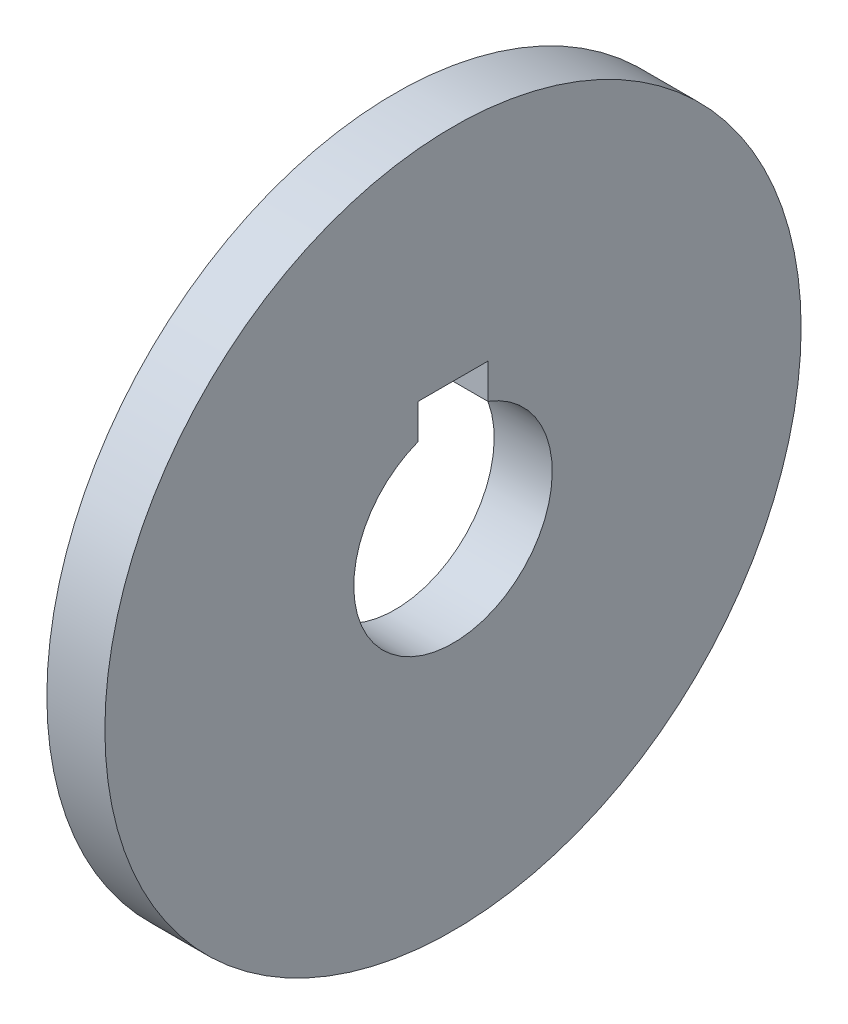
ISO-10303-21;
HEADER;
FILE_DESCRIPTION(('STEP AP214'),'2;1');
FILE_NAME('part.step','',(''),(''),'','','');
FILE_SCHEMA(('AUTOMOTIVE_DESIGN { 1 0 10303 214 1 1 1 1 }'));
ENDSEC;
DATA;
#1=APPLICATION_CONTEXT('core data for automotive mechanical design processes');
#2=APPLICATION_PROTOCOL_DEFINITION('international standard','automotive_design',2000,#1);
#3=PRODUCT_CONTEXT('',#1,'mechanical');
#4=PRODUCT('Part','Part','',(#3));
#5=PRODUCT_RELATED_PRODUCT_CATEGORY('part','',(#4));
#6=PRODUCT_DEFINITION_FORMATION('','',#4);
#7=PRODUCT_DEFINITION_CONTEXT('part definition',#1,'design');
#8=PRODUCT_DEFINITION('design','',#6,#7);
#9=PRODUCT_DEFINITION_SHAPE('','',#8);
#10=(LENGTH_UNIT() NAMED_UNIT(*) SI_UNIT(.MILLI.,.METRE.));
#11=(NAMED_UNIT(*) PLANE_ANGLE_UNIT() SI_UNIT($,.RADIAN.));
#12=(NAMED_UNIT(*) SI_UNIT($,.STERADIAN.) SOLID_ANGLE_UNIT());
#13=UNCERTAINTY_MEASURE_WITH_UNIT(LENGTH_MEASURE(1.E-05),#10,'distance_accuracy_value','');
#14=(GEOMETRIC_REPRESENTATION_CONTEXT(3) GLOBAL_UNCERTAINTY_ASSIGNED_CONTEXT((#13)) GLOBAL_UNIT_ASSIGNED_CONTEXT((#10,
#11,#12)) REPRESENTATION_CONTEXT('',''));
#15=CARTESIAN_POINT('',(0.,0.,0.));
#16=DIRECTION('',(0.,0.,1.));
#17=DIRECTION('',(1.,0.,0.));
#18=AXIS2_PLACEMENT_3D('',#15,#16,#17);
#19=CARTESIAN_POINT('',(2.5,0.,0.));
#20=DIRECTION('',(-1.,0.,0.));
#21=DIRECTION('',(0.,0.,1.));
#22=AXIS2_PLACEMENT_3D('',#19,#20,#21);
#23=CYLINDRICAL_SURFACE('',#22,30.);
#24=CARTESIAN_POINT('',(2.5,0.,0.));
#25=DIRECTION('',(1.,0.,0.));
#26=DIRECTION('',(0.,0.,-1.));
#27=AXIS2_PLACEMENT_3D('',#24,#25,#26);
#28=CIRCLE('',#27,30.);
#29=CARTESIAN_POINT('',(2.5,0.,-30.));
#30=VERTEX_POINT('',#29);
#31=EDGE_CURVE('E11',#30,#30,#28,.T.);
#32=ORIENTED_EDGE('',*,*,#31,.F.);
#33=EDGE_LOOP('',(#32));
#34=FACE_BOUND('',#33,.T.);
#35=CARTESIAN_POINT('',(-2.5,0.,0.));
#36=DIRECTION('',(1.,0.,0.));
#37=DIRECTION('',(0.,0.,-1.));
#38=AXIS2_PLACEMENT_3D('',#35,#36,#37);
#39=CIRCLE('',#38,30.);
#40=CARTESIAN_POINT('',(-2.5,0.,-30.));
#41=VERTEX_POINT('',#40);
#42=EDGE_CURVE('E48',#41,#41,#39,.T.);
#43=ORIENTED_EDGE('',*,*,#42,.T.);
#44=EDGE_LOOP('',(#43));
#45=FACE_BOUND('',#44,.T.);
#46=ADVANCED_FACE('F45',(#34,#45),#23,.T.);
#47=CARTESIAN_POINT('',(2.5,0.,0.));
#48=DIRECTION('',(1.,0.,0.));
#49=DIRECTION('',(0.,0.,-1.));
#50=AXIS2_PLACEMENT_3D('',#47,#48,#49);
#51=PLANE('',#50);
#52=DIRECTION('',(0.,1.,0.));
#53=VECTOR('',#52,1.);
#54=CARTESIAN_POINT('',(2.5,11.0064036870495,-3.));
#55=LINE('',#54,#53);
#56=CARTESIAN_POINT('',(2.5,8.00640368704951,-3.));
#57=VERTEX_POINT('',#56);
#58=CARTESIAN_POINT('',(2.5,11.0064036870495,-3.));
#59=VERTEX_POINT('',#58);
#60=EDGE_CURVE('E60',#57,#59,#55,.T.);
#61=ORIENTED_EDGE('',*,*,#60,.F.);
#62=CARTESIAN_POINT('',(2.5,0.,0.));
#63=DIRECTION('',(1.,0.,0.));
#64=DIRECTION('',(0.,0.,-1.));
#65=AXIS2_PLACEMENT_3D('',#62,#63,#64);
#66=CIRCLE('',#65,8.55);
#67=CARTESIAN_POINT('',(2.5,8.00640368704951,3.));
#68=VERTEX_POINT('',#67);
#69=EDGE_CURVE('E123',#68,#57,#66,.T.);
#70=ORIENTED_EDGE('',*,*,#69,.F.);
#71=DIRECTION('',(0.,-1.,0.));
#72=VECTOR('',#71,1.);
#73=CARTESIAN_POINT('',(2.5,11.0064036870495,3.));
#74=LINE('',#73,#72);
#75=CARTESIAN_POINT('',(2.5,11.0064036870495,3.));
#76=VERTEX_POINT('',#75);
#77=EDGE_CURVE('E88',#76,#68,#74,.T.);
#78=ORIENTED_EDGE('',*,*,#77,.F.);
#79=DIRECTION('',(0.,0.,1.));
#80=VECTOR('',#79,1.);
#81=CARTESIAN_POINT('',(2.5,11.0064036870495,0.));
#82=LINE('',#81,#80);
#83=EDGE_CURVE('E117',#59,#76,#82,.T.);
#84=ORIENTED_EDGE('',*,*,#83,.F.);
#85=EDGE_LOOP('',(#61,#70,#78,#84));
#86=FACE_BOUND('',#85,.T.);
#87=ORIENTED_EDGE('',*,*,#31,.T.);
#88=EDGE_LOOP('',(#87));
#89=FACE_BOUND('',#88,.T.);
#90=ADVANCED_FACE('F138',(#86,#89),#51,.T.);
#91=CARTESIAN_POINT('',(-2.5,0.,0.));
#92=DIRECTION('',(1.,0.,0.));
#93=DIRECTION('',(0.,0.,-1.));
#94=AXIS2_PLACEMENT_3D('',#91,#92,#93);
#95=PLANE('',#94);
#96=CARTESIAN_POINT('',(-2.5,0.,0.));
#97=DIRECTION('',(1.,0.,0.));
#98=DIRECTION('',(0.,0.,-1.));
#99=AXIS2_PLACEMENT_3D('',#96,#97,#98);
#100=CIRCLE('',#99,8.55);
#101=CARTESIAN_POINT('',(-2.5,8.00640368704951,3.));
#102=VERTEX_POINT('',#101);
#103=CARTESIAN_POINT('',(-2.5,8.00640368704951,-3.));
#104=VERTEX_POINT('',#103);
#105=EDGE_CURVE('E97',#102,#104,#100,.T.);
#106=ORIENTED_EDGE('',*,*,#105,.T.);
#107=DIRECTION('',(0.,1.,0.));
#108=VECTOR('',#107,1.);
#109=CARTESIAN_POINT('',(-2.5,11.0064036870495,-3.));
#110=LINE('',#109,#108);
#111=CARTESIAN_POINT('',(-2.5,11.0064036870495,-3.));
#112=VERTEX_POINT('',#111);
#113=EDGE_CURVE('E103',#104,#112,#110,.T.);
#114=ORIENTED_EDGE('',*,*,#113,.T.);
#115=DIRECTION('',(0.,0.,1.));
#116=VECTOR('',#115,1.);
#117=CARTESIAN_POINT('',(-2.5,11.0064036870495,0.));
#118=LINE('',#117,#116);
#119=CARTESIAN_POINT('',(-2.5,11.0064036870495,3.));
#120=VERTEX_POINT('',#119);
#121=EDGE_CURVE('E109',#112,#120,#118,.T.);
#122=ORIENTED_EDGE('',*,*,#121,.T.);
#123=DIRECTION('',(0.,-1.,0.));
#124=VECTOR('',#123,1.);
#125=CARTESIAN_POINT('',(-2.5,11.0064036870495,3.));
#126=LINE('',#125,#124);
#127=EDGE_CURVE('E68',#120,#102,#126,.T.);
#128=ORIENTED_EDGE('',*,*,#127,.T.);
#129=EDGE_LOOP('',(#106,#114,#122,#128));
#130=FACE_BOUND('',#129,.T.);
#131=ORIENTED_EDGE('',*,*,#42,.F.);
#132=EDGE_LOOP('',(#131));
#133=FACE_BOUND('',#132,.T.);
#134=ADVANCED_FACE('F106',(#130,#133),#95,.F.);
#135=CARTESIAN_POINT('',(-2.5,11.0064036870495,-3.));
#136=DIRECTION('',(0.,0.,-1.));
#137=DIRECTION('',(0.,1.,0.));
#138=AXIS2_PLACEMENT_3D('',#135,#136,#137);
#139=PLANE('',#138);
#140=ORIENTED_EDGE('',*,*,#60,.T.);
#141=DIRECTION('',(1.,0.,0.));
#142=VECTOR('',#141,1.);
#143=CARTESIAN_POINT('',(-2.5,11.0064036870495,-3.));
#144=LINE('',#143,#142);
#145=EDGE_CURVE('E128',#112,#59,#144,.T.);
#146=ORIENTED_EDGE('',*,*,#145,.F.);
#147=ORIENTED_EDGE('',*,*,#113,.F.);
#148=DIRECTION('',(1.,0.,0.));
#149=VECTOR('',#148,1.);
#150=CARTESIAN_POINT('',(-2.5,8.00640368704951,-3.));
#151=LINE('',#150,#149);
#152=EDGE_CURVE('E93',#104,#57,#151,.T.);
#153=ORIENTED_EDGE('',*,*,#152,.T.);
#154=EDGE_LOOP('',(#140,#146,#147,#153));
#155=FACE_BOUND('',#154,.T.);
#156=ADVANCED_FACE('F150',(#155),#139,.F.);
#157=CARTESIAN_POINT('',(-2.5,0.,0.));
#158=DIRECTION('',(1.,0.,0.));
#159=DIRECTION('',(0.,0.,-1.));
#160=AXIS2_PLACEMENT_3D('',#157,#158,#159);
#161=CYLINDRICAL_SURFACE('',#160,8.55);
#162=ORIENTED_EDGE('',*,*,#69,.T.);
#163=ORIENTED_EDGE('',*,*,#152,.F.);
#164=ORIENTED_EDGE('',*,*,#105,.F.);
#165=DIRECTION('',(1.,0.,0.));
#166=VECTOR('',#165,1.);
#167=CARTESIAN_POINT('',(-2.5,8.00640368704951,3.));
#168=LINE('',#167,#166);
#169=EDGE_CURVE('E84',#102,#68,#168,.T.);
#170=ORIENTED_EDGE('',*,*,#169,.T.);
#171=EDGE_LOOP('',(#162,#163,#164,#170));
#172=FACE_BOUND('',#171,.T.);
#173=ADVANCED_FACE('F98',(#172),#161,.F.);
#174=CARTESIAN_POINT('',(-2.5,11.0064036870495,3.));
#175=DIRECTION('',(0.,0.,1.));
#176=DIRECTION('',(0.,-1.,0.));
#177=AXIS2_PLACEMENT_3D('',#174,#175,#176);
#178=PLANE('',#177);
#179=ORIENTED_EDGE('',*,*,#77,.T.);
#180=ORIENTED_EDGE('',*,*,#169,.F.);
#181=ORIENTED_EDGE('',*,*,#127,.F.);
#182=DIRECTION('',(1.,0.,0.));
#183=VECTOR('',#182,1.);
#184=CARTESIAN_POINT('',(-2.5,11.0064036870495,3.));
#185=LINE('',#184,#183);
#186=EDGE_CURVE('E94',#120,#76,#185,.T.);
#187=ORIENTED_EDGE('',*,*,#186,.T.);
#188=EDGE_LOOP('',(#179,#180,#181,#187));
#189=FACE_BOUND('',#188,.T.);
#190=ADVANCED_FACE('F86',(#189),#178,.F.);
#191=CARTESIAN_POINT('',(-2.5,11.0064036870495,0.));
#192=DIRECTION('',(0.,1.,0.));
#193=DIRECTION('',(0.,0.,1.));
#194=AXIS2_PLACEMENT_3D('',#191,#192,#193);
#195=PLANE('',#194);
#196=ORIENTED_EDGE('',*,*,#83,.T.);
#197=ORIENTED_EDGE('',*,*,#186,.F.);
#198=ORIENTED_EDGE('',*,*,#121,.F.);
#199=ORIENTED_EDGE('',*,*,#145,.T.);
#200=EDGE_LOOP('',(#196,#197,#198,#199));
#201=FACE_BOUND('',#200,.T.);
#202=ADVANCED_FACE('F136',(#201),#195,.F.);
#203=CLOSED_SHELL('',(#46,#90,#134,#156,#173,#190,#202));
#204=MANIFOLD_SOLID_BREP('B2',#203);
#205=ADVANCED_BREP_SHAPE_REPRESENTATION('',(#18,#204),#14);
#206=SHAPE_DEFINITION_REPRESENTATION(#9,#205);
ENDSEC;
END-ISO-10303-21;
